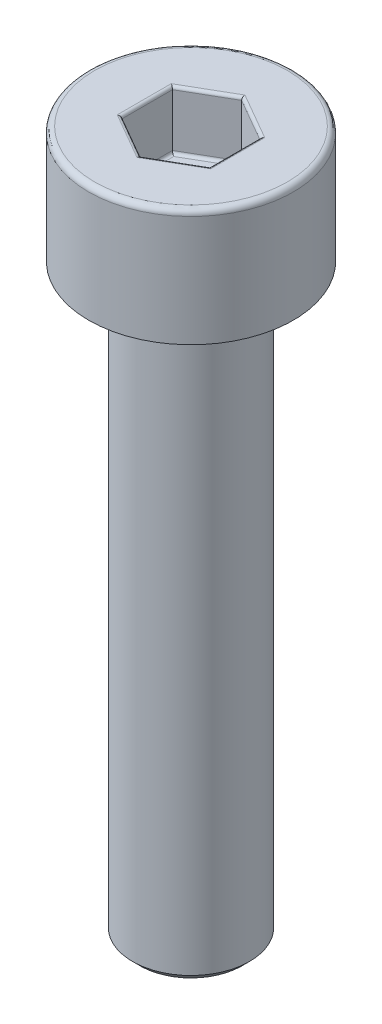
ISO-10303-21;
HEADER;
FILE_DESCRIPTION(('STEP AP214'),'2;1');
FILE_NAME('part.step','',(''),(''),'','','');
FILE_SCHEMA(('AUTOMOTIVE_DESIGN { 1 0 10303 214 1 1 1 1 }'));
ENDSEC;
DATA;
#1=APPLICATION_CONTEXT('core data for automotive mechanical design processes');
#2=APPLICATION_PROTOCOL_DEFINITION('international standard','automotive_design',2000,#1);
#3=PRODUCT_CONTEXT('',#1,'mechanical');
#4=PRODUCT('Part','Part','',(#3));
#5=PRODUCT_RELATED_PRODUCT_CATEGORY('part','',(#4));
#6=PRODUCT_DEFINITION_FORMATION('','',#4);
#7=PRODUCT_DEFINITION_CONTEXT('part definition',#1,'design');
#8=PRODUCT_DEFINITION('design','',#6,#7);
#9=PRODUCT_DEFINITION_SHAPE('','',#8);
#10=(LENGTH_UNIT() NAMED_UNIT(*) SI_UNIT(.MILLI.,.METRE.));
#11=(NAMED_UNIT(*) PLANE_ANGLE_UNIT() SI_UNIT($,.RADIAN.));
#12=(NAMED_UNIT(*) SI_UNIT($,.STERADIAN.) SOLID_ANGLE_UNIT());
#13=UNCERTAINTY_MEASURE_WITH_UNIT(LENGTH_MEASURE(1.E-05),#10,'distance_accuracy_value','');
#14=(GEOMETRIC_REPRESENTATION_CONTEXT(3) GLOBAL_UNCERTAINTY_ASSIGNED_CONTEXT((#13)) GLOBAL_UNIT_ASSIGNED_CONTEXT((#10,
#11,#12)) REPRESENTATION_CONTEXT('',''));
#15=CARTESIAN_POINT('',(0.,0.,0.));
#16=DIRECTION('',(0.,0.,1.));
#17=DIRECTION('',(1.,0.,0.));
#18=AXIS2_PLACEMENT_3D('',#15,#16,#17);
#19=CARTESIAN_POINT('',(0.,-24.,0.));
#20=DIRECTION('',(0.,-1.,0.));
#21=DIRECTION('',(0.,0.,-1.));
#22=AXIS2_PLACEMENT_3D('',#19,#20,#21);
#23=PLANE('',#22);
#24=CARTESIAN_POINT('',(0.,-24.,0.));
#25=DIRECTION('',(0.,-1.,0.));
#26=DIRECTION('',(0.,0.,-1.));
#27=AXIS2_PLACEMENT_3D('',#24,#25,#26);
#28=CIRCLE('',#27,1.74999999999998);
#29=CARTESIAN_POINT('',(0.,-24.,-1.74999999999998));
#30=VERTEX_POINT('',#29);
#31=EDGE_CURVE('E261',#30,#30,#28,.T.);
#32=ORIENTED_EDGE('',*,*,#31,.T.);
#33=EDGE_LOOP('',(#32));
#34=FACE_BOUND('',#33,.T.);
#35=ADVANCED_FACE('F33',(#34),#23,.T.);
#36=CARTESIAN_POINT('',(0.,0.,0.));
#37=DIRECTION('',(0.,1.,0.));
#38=DIRECTION('',(0.,0.,1.));
#39=AXIS2_PLACEMENT_3D('',#36,#37,#38);
#40=CYLINDRICAL_SURFACE('',#39,2.);
#41=CARTESIAN_POINT('',(0.,-4.25,0.));
#42=DIRECTION('',(0.,-1.,0.));
#43=DIRECTION('',(0.,0.,-1.));
#44=AXIS2_PLACEMENT_3D('',#41,#42,#43);
#45=CIRCLE('',#44,2.);
#46=CARTESIAN_POINT('',(0.,-4.25,-2.));
#47=VERTEX_POINT('',#46);
#48=EDGE_CURVE('E258',#47,#47,#45,.T.);
#49=ORIENTED_EDGE('',*,*,#48,.T.);
#50=EDGE_LOOP('',(#49));
#51=FACE_BOUND('',#50,.T.);
#52=CARTESIAN_POINT('',(0.,-23.75,0.));
#53=DIRECTION('',(0.,-1.,0.));
#54=DIRECTION('',(0.,0.,-1.));
#55=AXIS2_PLACEMENT_3D('',#52,#53,#54);
#56=CIRCLE('',#55,2.);
#57=CARTESIAN_POINT('',(0.,-23.75,-2.));
#58=VERTEX_POINT('',#57);
#59=EDGE_CURVE('E255',#58,#58,#56,.F.);
#60=ORIENTED_EDGE('',*,*,#59,.T.);
#61=EDGE_LOOP('',(#60));
#62=FACE_BOUND('',#61,.T.);
#63=ADVANCED_FACE('F287',(#51,#62),#40,.T.);
#64=CARTESIAN_POINT('',(-2.,-4.,0.));
#65=DIRECTION('',(0.,-1.,0.));
#66=DIRECTION('',(0.,0.,-1.));
#67=AXIS2_PLACEMENT_3D('',#64,#65,#66);
#68=PLANE('',#67);
#69=CARTESIAN_POINT('',(0.,-4.,0.));
#70=DIRECTION('',(0.,-1.,0.));
#71=DIRECTION('',(0.,0.,-1.));
#72=AXIS2_PLACEMENT_3D('',#69,#70,#71);
#73=CIRCLE('',#72,2.25);
#74=CARTESIAN_POINT('',(0.,-4.,-2.25));
#75=VERTEX_POINT('',#74);
#76=EDGE_CURVE('E252',#75,#75,#73,.F.);
#77=ORIENTED_EDGE('',*,*,#76,.T.);
#78=EDGE_LOOP('',(#77));
#79=FACE_BOUND('',#78,.T.);
#80=CARTESIAN_POINT('',(0.,-4.,0.));
#81=DIRECTION('',(0.,1.,0.));
#82=DIRECTION('',(0.,0.,1.));
#83=AXIS2_PLACEMENT_3D('',#80,#81,#82);
#84=CIRCLE('',#83,3.5);
#85=CARTESIAN_POINT('',(0.,-4.,3.5));
#86=VERTEX_POINT('',#85);
#87=EDGE_CURVE('E249',#86,#86,#84,.T.);
#88=ORIENTED_EDGE('',*,*,#87,.F.);
#89=EDGE_LOOP('',(#88));
#90=FACE_BOUND('',#89,.T.);
#91=ADVANCED_FACE('F293',(#79,#90),#68,.T.);
#92=CARTESIAN_POINT('',(0.,0.,0.));
#93=DIRECTION('',(0.,1.,0.));
#94=DIRECTION('',(0.,0.,1.));
#95=AXIS2_PLACEMENT_3D('',#92,#93,#94);
#96=CYLINDRICAL_SURFACE('',#95,3.5);
#97=CARTESIAN_POINT('',(0.,-0.2,0.));
#98=DIRECTION('',(0.,1.,0.));
#99=DIRECTION('',(0.,0.,1.));
#100=AXIS2_PLACEMENT_3D('',#97,#98,#99);
#101=CIRCLE('',#100,3.5);
#102=CARTESIAN_POINT('',(0.,-0.2,3.5));
#103=VERTEX_POINT('',#102);
#104=EDGE_CURVE('E159',#103,#103,#101,.F.);
#105=ORIENTED_EDGE('',*,*,#104,.T.);
#106=EDGE_LOOP('',(#105));
#107=FACE_BOUND('',#106,.T.);
#108=ORIENTED_EDGE('',*,*,#87,.T.);
#109=EDGE_LOOP('',(#108));
#110=FACE_BOUND('',#109,.T.);
#111=ADVANCED_FACE('F303',(#107,#110),#96,.T.);
#112=CARTESIAN_POINT('',(-3.5,0.,0.));
#113=DIRECTION('',(0.,1.,0.));
#114=DIRECTION('',(0.,0.,1.));
#115=AXIS2_PLACEMENT_3D('',#112,#113,#114);
#116=PLANE('',#115);
#117=DIRECTION('',(0.,0.,1.));
#118=VECTOR('',#117,1.);
#119=CARTESIAN_POINT('',(-1.6,0.,-0.86602540378444));
#120=LINE('',#119,#118);
#121=CARTESIAN_POINT('',(-1.6,0.,0.923760430703401));
#122=VERTEX_POINT('',#121);
#123=CARTESIAN_POINT('',(-1.6,0.,-0.923760430703403));
#124=VERTEX_POINT('',#123);
#125=EDGE_CURVE('E175',#122,#124,#120,.F.);
#126=ORIENTED_EDGE('',*,*,#125,.T.);
#127=DIRECTION('',(-0.866025403784439,0.,0.5));
#128=VECTOR('',#127,1.);
#129=CARTESIAN_POINT('',(-0.0499999999999999,0.,-1.81865334794732));
#130=LINE('',#129,#128);
#131=CARTESIAN_POINT('',(0.,0.,-1.8475208614068));
#132=VERTEX_POINT('',#131);
#133=EDGE_CURVE('E134',#124,#132,#130,.F.);
#134=ORIENTED_EDGE('',*,*,#133,.T.);
#135=DIRECTION('',(-0.866025403784439,0.,-0.5));
#136=VECTOR('',#135,1.);
#137=CARTESIAN_POINT('',(1.55,0.,-0.952627944162884));
#138=LINE('',#137,#136);
#139=CARTESIAN_POINT('',(1.6,0.,-0.923760430703403));
#140=VERTEX_POINT('',#139);
#141=EDGE_CURVE('E161',#132,#140,#138,.F.);
#142=ORIENTED_EDGE('',*,*,#141,.T.);
#143=DIRECTION('',(0.,0.,-1.));
#144=VECTOR('',#143,1.);
#145=CARTESIAN_POINT('',(1.6,0.,0.866025403784439));
#146=LINE('',#145,#144);
#147=CARTESIAN_POINT('',(1.6,0.,0.923760430703402));
#148=VERTEX_POINT('',#147);
#149=EDGE_CURVE('E169',#140,#148,#146,.F.);
#150=ORIENTED_EDGE('',*,*,#149,.T.);
#151=DIRECTION('',(0.866025403784439,0.,-0.5));
#152=VECTOR('',#151,1.);
#153=CARTESIAN_POINT('',(0.0499999999999988,0.,1.81865334794732));
#154=LINE('',#153,#152);
#155=CARTESIAN_POINT('',(0.,0.,1.8475208614068));
#156=VERTEX_POINT('',#155);
#157=EDGE_CURVE('E171',#148,#156,#154,.F.);
#158=ORIENTED_EDGE('',*,*,#157,.T.);
#159=DIRECTION('',(0.866025403784439,0.,0.5));
#160=VECTOR('',#159,1.);
#161=CARTESIAN_POINT('',(-1.55,0.,0.952627944162882));
#162=LINE('',#161,#160);
#163=EDGE_CURVE('E173',#156,#122,#162,.F.);
#164=ORIENTED_EDGE('',*,*,#163,.T.);
#165=EDGE_LOOP('',(#126,#134,#142,#150,#158,#164));
#166=FACE_BOUND('',#165,.T.);
#167=CARTESIAN_POINT('',(0.,0.,0.));
#168=DIRECTION('',(0.,1.,0.));
#169=DIRECTION('',(0.,0.,1.));
#170=AXIS2_PLACEMENT_3D('',#167,#168,#169);
#171=CIRCLE('',#170,3.3);
#172=CARTESIAN_POINT('',(0.,0.,3.3));
#173=VERTEX_POINT('',#172);
#174=EDGE_CURVE('E164',#173,#173,#171,.T.);
#175=ORIENTED_EDGE('',*,*,#174,.T.);
#176=EDGE_LOOP('',(#175));
#177=FACE_BOUND('',#176,.T.);
#178=ADVANCED_FACE('F266',(#166,#177),#116,.T.);
#179=CARTESIAN_POINT('',(0.,-4.,0.));
#180=DIRECTION('',(0.,1.,0.));
#181=DIRECTION('',(0.,0.,1.));
#182=AXIS2_PLACEMENT_3D('',#179,#180,#181);
#183=CONICAL_SURFACE('',#182,2.25,0.785398163397454);
#184=ORIENTED_EDGE('',*,*,#48,.F.);
#185=EDGE_LOOP('',(#184));
#186=FACE_BOUND('',#185,.T.);
#187=ORIENTED_EDGE('',*,*,#76,.F.);
#188=EDGE_LOOP('',(#187));
#189=FACE_BOUND('',#188,.T.);
#190=ADVANCED_FACE('F281',(#186,#189),#183,.T.);
#191=CARTESIAN_POINT('',(0.,-23.75,0.));
#192=DIRECTION('',(0.,1.,0.));
#193=DIRECTION('',(0.,0.,1.));
#194=AXIS2_PLACEMENT_3D('',#191,#192,#193);
#195=CONICAL_SURFACE('',#194,2.,0.785398163397456);
#196=ORIENTED_EDGE('',*,*,#31,.F.);
#197=EDGE_LOOP('',(#196));
#198=FACE_BOUND('',#197,.T.);
#199=ORIENTED_EDGE('',*,*,#59,.F.);
#200=EDGE_LOOP('',(#199));
#201=FACE_BOUND('',#200,.T.);
#202=ADVANCED_FACE('F271',(#198,#201),#195,.T.);
#203=CARTESIAN_POINT('',(0.,-0.2,0.));
#204=DIRECTION('',(0.,1.,0.));
#205=DIRECTION('',(0.,0.,1.));
#206=AXIS2_PLACEMENT_3D('',#203,#204,#205);
#207=TOROIDAL_SURFACE('',#206,3.3,0.2);
#208=ORIENTED_EDGE('',*,*,#104,.F.);
#209=EDGE_LOOP('',(#208));
#210=FACE_BOUND('',#209,.T.);
#211=ORIENTED_EDGE('',*,*,#174,.F.);
#212=EDGE_LOOP('',(#211));
#213=FACE_BOUND('',#212,.T.);
#214=ADVANCED_FACE('F268',(#210,#213),#207,.T.);
#215=CARTESIAN_POINT('',(1.5,-2.,-0.86602540378444));
#216=DIRECTION('',(0.5,0.,-0.866025403784439));
#217=DIRECTION('',(-0.866025403784439,0.,-0.5));
#218=AXIS2_PLACEMENT_3D('',#215,#216,#217);
#219=PLANE('',#218);
#220=DIRECTION('',(0.,1.,0.));
#221=VECTOR('',#220,1.);
#222=CARTESIAN_POINT('',(1.5,-2.,-0.86602540378444));
#223=LINE('',#222,#221);
#224=CARTESIAN_POINT('',(1.5,-1.9,-0.86602540378444));
#225=VERTEX_POINT('',#224);
#226=CARTESIAN_POINT('',(1.5,-0.1,-0.86602540378444));
#227=VERTEX_POINT('',#226);
#228=EDGE_CURVE('E243',#225,#227,#223,.T.);
#229=ORIENTED_EDGE('',*,*,#228,.T.);
#230=DIRECTION('',(-0.866025403784439,0.,-0.5));
#231=VECTOR('',#230,1.);
#232=CARTESIAN_POINT('',(0.,-0.1,-1.73205080756888));
#233=LINE('',#232,#231);
#234=CARTESIAN_POINT('',(0.,-0.1,-1.73205080756888));
#235=VERTEX_POINT('',#234);
#236=EDGE_CURVE('E195',#227,#235,#233,.T.);
#237=ORIENTED_EDGE('',*,*,#236,.T.);
#238=DIRECTION('',(0.,1.,0.));
#239=VECTOR('',#238,1.);
#240=CARTESIAN_POINT('',(0.,-2.,-1.73205080756888));
#241=LINE('',#240,#239);
#242=CARTESIAN_POINT('',(0.,-1.9,-1.73205080756888));
#243=VERTEX_POINT('',#242);
#244=EDGE_CURVE('E145',#243,#235,#241,.T.);
#245=ORIENTED_EDGE('',*,*,#244,.F.);
#246=DIRECTION('',(-0.866025403784439,0.,-0.5));
#247=VECTOR('',#246,1.);
#248=CARTESIAN_POINT('',(1.5,-1.9,-0.86602540378444));
#249=LINE('',#248,#247);
#250=EDGE_CURVE('E193',#243,#225,#249,.F.);
#251=ORIENTED_EDGE('',*,*,#250,.T.);
#252=EDGE_LOOP('',(#229,#237,#245,#251));
#253=FACE_BOUND('',#252,.T.);
#254=ADVANCED_FACE('F270',(#253),#219,.F.);
#255=CARTESIAN_POINT('',(1.5,-2.,0.866025403784439));
#256=DIRECTION('',(1.,0.,0.));
#257=DIRECTION('',(0.,0.,-1.));
#258=AXIS2_PLACEMENT_3D('',#255,#256,#257);
#259=PLANE('',#258);
#260=DIRECTION('',(0.,1.,0.));
#261=VECTOR('',#260,1.);
#262=CARTESIAN_POINT('',(1.5,-2.,0.866025403784439));
#263=LINE('',#262,#261);
#264=CARTESIAN_POINT('',(1.5,-1.9,0.866025403784439));
#265=VERTEX_POINT('',#264);
#266=CARTESIAN_POINT('',(1.5,-0.1,0.866025403784439));
#267=VERTEX_POINT('',#266);
#268=EDGE_CURVE('E240',#265,#267,#263,.T.);
#269=ORIENTED_EDGE('',*,*,#268,.T.);
#270=DIRECTION('',(0.,0.,-1.));
#271=VECTOR('',#270,1.);
#272=CARTESIAN_POINT('',(1.5,-0.1,-0.86602540378444));
#273=LINE('',#272,#271);
#274=EDGE_CURVE('E191',#267,#227,#273,.T.);
#275=ORIENTED_EDGE('',*,*,#274,.T.);
#276=ORIENTED_EDGE('',*,*,#228,.F.);
#277=DIRECTION('',(0.,0.,-1.));
#278=VECTOR('',#277,1.);
#279=CARTESIAN_POINT('',(1.5,-1.9,0.866025403784439));
#280=LINE('',#279,#278);
#281=EDGE_CURVE('E188',#225,#265,#280,.F.);
#282=ORIENTED_EDGE('',*,*,#281,.T.);
#283=EDGE_LOOP('',(#269,#275,#276,#282));
#284=FACE_BOUND('',#283,.T.);
#285=ADVANCED_FACE('F278',(#284),#259,.F.);
#286=CARTESIAN_POINT('',(0.,-2.,1.73205080756888));
#287=DIRECTION('',(0.5,0.,0.866025403784439));
#288=DIRECTION('',(0.866025403784439,0.,-0.5));
#289=AXIS2_PLACEMENT_3D('',#286,#287,#288);
#290=PLANE('',#289);
#291=DIRECTION('',(0.,1.,0.));
#292=VECTOR('',#291,1.);
#293=CARTESIAN_POINT('',(0.,-2.,1.73205080756888));
#294=LINE('',#293,#292);
#295=CARTESIAN_POINT('',(0.,-1.9,1.73205080756888));
#296=VERTEX_POINT('',#295);
#297=CARTESIAN_POINT('',(0.,-0.1,1.73205080756888));
#298=VERTEX_POINT('',#297);
#299=EDGE_CURVE('E237',#296,#298,#294,.T.);
#300=ORIENTED_EDGE('',*,*,#299,.T.);
#301=DIRECTION('',(0.866025403784439,0.,-0.5));
#302=VECTOR('',#301,1.);
#303=CARTESIAN_POINT('',(1.5,-0.1,0.866025403784439));
#304=LINE('',#303,#302);
#305=EDGE_CURVE('E186',#298,#267,#304,.T.);
#306=ORIENTED_EDGE('',*,*,#305,.T.);
#307=ORIENTED_EDGE('',*,*,#268,.F.);
#308=DIRECTION('',(0.866025403784439,0.,-0.5));
#309=VECTOR('',#308,1.);
#310=CARTESIAN_POINT('',(0.,-1.9,1.73205080756888));
#311=LINE('',#310,#309);
#312=EDGE_CURVE('E184',#265,#296,#311,.F.);
#313=ORIENTED_EDGE('',*,*,#312,.T.);
#314=EDGE_LOOP('',(#300,#306,#307,#313));
#315=FACE_BOUND('',#314,.T.);
#316=ADVANCED_FACE('F327',(#315),#290,.F.);
#317=CARTESIAN_POINT('',(-1.5,-2.,0.866025403784438));
#318=DIRECTION('',(-0.5,0.,0.866025403784439));
#319=DIRECTION('',(0.866025403784439,0.,0.5));
#320=AXIS2_PLACEMENT_3D('',#317,#318,#319);
#321=PLANE('',#320);
#322=DIRECTION('',(0.,1.,0.));
#323=VECTOR('',#322,1.);
#324=CARTESIAN_POINT('',(-1.5,-2.,0.866025403784438));
#325=LINE('',#324,#323);
#326=CARTESIAN_POINT('',(-1.5,-1.9,0.866025403784438));
#327=VERTEX_POINT('',#326);
#328=CARTESIAN_POINT('',(-1.5,-0.1,0.866025403784438));
#329=VERTEX_POINT('',#328);
#330=EDGE_CURVE('E128',#327,#329,#325,.T.);
#331=ORIENTED_EDGE('',*,*,#330,.T.);
#332=DIRECTION('',(0.866025403784439,0.,0.5));
#333=VECTOR('',#332,1.);
#334=CARTESIAN_POINT('',(0.,-0.1,1.73205080756888));
#335=LINE('',#334,#333);
#336=EDGE_CURVE('E182',#329,#298,#335,.T.);
#337=ORIENTED_EDGE('',*,*,#336,.T.);
#338=ORIENTED_EDGE('',*,*,#299,.F.);
#339=DIRECTION('',(0.866025403784439,0.,0.5));
#340=VECTOR('',#339,1.);
#341=CARTESIAN_POINT('',(-1.5,-1.9,0.866025403784438));
#342=LINE('',#341,#340);
#343=EDGE_CURVE('E180',#296,#327,#342,.F.);
#344=ORIENTED_EDGE('',*,*,#343,.T.);
#345=EDGE_LOOP('',(#331,#337,#338,#344));
#346=FACE_BOUND('',#345,.T.);
#347=ADVANCED_FACE('F234',(#346),#321,.F.);
#348=CARTESIAN_POINT('',(-1.5,-2.,-0.86602540378444));
#349=DIRECTION('',(-1.,0.,0.));
#350=DIRECTION('',(0.,0.,1.));
#351=AXIS2_PLACEMENT_3D('',#348,#349,#350);
#352=PLANE('',#351);
#353=DIRECTION('',(0.,1.,0.));
#354=VECTOR('',#353,1.);
#355=CARTESIAN_POINT('',(-1.5,-2.,-0.86602540378444));
#356=LINE('',#355,#354);
#357=CARTESIAN_POINT('',(-1.5,-1.9,-0.86602540378444));
#358=VERTEX_POINT('',#357);
#359=CARTESIAN_POINT('',(-1.5,-0.1,-0.86602540378444));
#360=VERTEX_POINT('',#359);
#361=EDGE_CURVE('E126',#358,#360,#356,.T.);
#362=ORIENTED_EDGE('',*,*,#361,.T.);
#363=DIRECTION('',(0.,0.,1.));
#364=VECTOR('',#363,1.);
#365=CARTESIAN_POINT('',(-1.5,-0.1,0.866025403784438));
#366=LINE('',#365,#364);
#367=EDGE_CURVE('E133',#360,#329,#366,.T.);
#368=ORIENTED_EDGE('',*,*,#367,.T.);
#369=ORIENTED_EDGE('',*,*,#330,.F.);
#370=DIRECTION('',(0.,0.,1.));
#371=VECTOR('',#370,1.);
#372=CARTESIAN_POINT('',(-1.5,-1.9,-0.86602540378444));
#373=LINE('',#372,#371);
#374=EDGE_CURVE('E123',#327,#358,#373,.F.);
#375=ORIENTED_EDGE('',*,*,#374,.T.);
#376=EDGE_LOOP('',(#362,#368,#369,#375));
#377=FACE_BOUND('',#376,.T.);
#378=ADVANCED_FACE('F125',(#377),#352,.F.);
#379=CARTESIAN_POINT('',(0.,-2.,-1.73205080756888));
#380=DIRECTION('',(-0.5,0.,-0.866025403784439));
#381=DIRECTION('',(-0.866025403784439,0.,0.5));
#382=AXIS2_PLACEMENT_3D('',#379,#380,#381);
#383=PLANE('',#382);
#384=ORIENTED_EDGE('',*,*,#244,.T.);
#385=DIRECTION('',(-0.866025403784439,0.,0.5));
#386=VECTOR('',#385,1.);
#387=CARTESIAN_POINT('',(-1.5,-0.1,-0.86602540378444));
#388=LINE('',#387,#386);
#389=EDGE_CURVE('E144',#235,#360,#388,.T.);
#390=ORIENTED_EDGE('',*,*,#389,.T.);
#391=ORIENTED_EDGE('',*,*,#361,.F.);
#392=DIRECTION('',(-0.866025403784439,0.,0.5));
#393=VECTOR('',#392,1.);
#394=CARTESIAN_POINT('',(0.,-1.9,-1.73205080756888));
#395=LINE('',#394,#393);
#396=EDGE_CURVE('E141',#358,#243,#395,.F.);
#397=ORIENTED_EDGE('',*,*,#396,.T.);
#398=EDGE_LOOP('',(#384,#390,#391,#397));
#399=FACE_BOUND('',#398,.T.);
#400=ADVANCED_FACE('F139',(#399),#383,.F.);
#401=CARTESIAN_POINT('',(1.5,-2.,-0.86602540378444));
#402=DIRECTION('',(0.,-1.,0.));
#403=DIRECTION('',(0.,0.,-1.));
#404=AXIS2_PLACEMENT_3D('',#401,#402,#403);
#405=PLANE('',#404);
#406=DIRECTION('',(0.866025403784439,0.,-0.5));
#407=VECTOR('',#406,1.);
#408=CARTESIAN_POINT('',(1.45,-2.,0.779422863405995));
#409=LINE('',#408,#407);
#410=CARTESIAN_POINT('',(0.,-2.,1.61658075373095));
#411=VERTEX_POINT('',#410);
#412=CARTESIAN_POINT('',(1.4,-2.,0.808290376865476));
#413=VERTEX_POINT('',#412);
#414=EDGE_CURVE('E42',#411,#413,#409,.T.);
#415=ORIENTED_EDGE('',*,*,#414,.T.);
#416=DIRECTION('',(0.,0.,-1.));
#417=VECTOR('',#416,1.);
#418=CARTESIAN_POINT('',(1.4,-2.,-0.86602540378444));
#419=LINE('',#418,#417);
#420=CARTESIAN_POINT('',(1.4,-2.,-0.808290376865478));
#421=VERTEX_POINT('',#420);
#422=EDGE_CURVE('E11',#413,#421,#419,.T.);
#423=ORIENTED_EDGE('',*,*,#422,.T.);
#424=DIRECTION('',(-0.866025403784439,0.,-0.5));
#425=VECTOR('',#424,1.);
#426=CARTESIAN_POINT('',(-0.0500000000000001,-2.,-1.64544826719043));
#427=LINE('',#426,#425);
#428=CARTESIAN_POINT('',(0.,-2.,-1.61658075373095));
#429=VERTEX_POINT('',#428);
#430=EDGE_CURVE('E197',#421,#429,#427,.T.);
#431=ORIENTED_EDGE('',*,*,#430,.T.);
#432=DIRECTION('',(-0.866025403784439,0.,0.5));
#433=VECTOR('',#432,1.);
#434=CARTESIAN_POINT('',(-1.45,-2.,-0.779422863405997));
#435=LINE('',#434,#433);
#436=CARTESIAN_POINT('',(-1.4,-2.,-0.808290376865478));
#437=VERTEX_POINT('',#436);
#438=EDGE_CURVE('E199',#429,#437,#435,.T.);
#439=ORIENTED_EDGE('',*,*,#438,.T.);
#440=DIRECTION('',(0.,0.,1.));
#441=VECTOR('',#440,1.);
#442=CARTESIAN_POINT('',(-1.4,-2.,0.866025403784438));
#443=LINE('',#442,#441);
#444=CARTESIAN_POINT('',(-1.4,-2.,0.808290376865476));
#445=VERTEX_POINT('',#444);
#446=EDGE_CURVE('E150',#437,#445,#443,.T.);
#447=ORIENTED_EDGE('',*,*,#446,.T.);
#448=DIRECTION('',(0.866025403784439,0.,0.5));
#449=VECTOR('',#448,1.);
#450=CARTESIAN_POINT('',(0.0499999999999989,-2.,1.64544826719043));
#451=LINE('',#450,#449);
#452=EDGE_CURVE('E53',#445,#411,#451,.T.);
#453=ORIENTED_EDGE('',*,*,#452,.T.);
#454=EDGE_LOOP('',(#415,#423,#431,#439,#447,#453));
#455=FACE_BOUND('',#454,.T.);
#456=ADVANCED_FACE('F322',(#455),#405,.F.);
#457=CARTESIAN_POINT('',(0.0499999999999988,-0.1,1.81865334794732));
#458=DIRECTION('',(-0.866025403784439,0.,0.5));
#459=DIRECTION('',(0.5,0.,0.866025403784439));
#460=AXIS2_PLACEMENT_3D('',#457,#458,#459);
#461=CYLINDRICAL_SURFACE('',#460,0.1);
#462=CARTESIAN_POINT('',(0.,-0.1,1.8475208614068));
#463=DIRECTION('',(-1.,0.,0.));
#464=DIRECTION('',(0.,0.,-1.));
#465=AXIS2_PLACEMENT_3D('',#462,#463,#464);
#466=ELLIPSE('',#465,0.115470053837925,0.1);
#467=EDGE_CURVE('E214',#156,#298,#466,.T.);
#468=ORIENTED_EDGE('',*,*,#467,.F.);
#469=ORIENTED_EDGE('',*,*,#157,.F.);
#470=CARTESIAN_POINT('',(1.6,-0.1,0.923760430703402));
#471=DIRECTION('',(-0.5,0.,0.866025403784439));
#472=DIRECTION('',(-0.866025403784439,0.,-0.5));
#473=AXIS2_PLACEMENT_3D('',#470,#471,#472);
#474=ELLIPSE('',#473,0.115470053837925,0.1);
#475=EDGE_CURVE('E217',#267,#148,#474,.F.);
#476=ORIENTED_EDGE('',*,*,#475,.F.);
#477=ORIENTED_EDGE('',*,*,#305,.F.);
#478=EDGE_LOOP('',(#468,#469,#476,#477));
#479=FACE_BOUND('',#478,.T.);
#480=ADVANCED_FACE('F334',(#479),#461,.T.);
#481=CARTESIAN_POINT('',(1.6,-0.1,0.866025403784439));
#482=DIRECTION('',(0.,0.,1.));
#483=DIRECTION('',(1.,0.,0.));
#484=AXIS2_PLACEMENT_3D('',#481,#482,#483);
#485=CYLINDRICAL_SURFACE('',#484,0.1);
#486=ORIENTED_EDGE('',*,*,#475,.T.);
#487=ORIENTED_EDGE('',*,*,#149,.F.);
#488=CARTESIAN_POINT('',(1.6,-0.1,-0.923760430703402));
#489=DIRECTION('',(0.5,0.,0.866025403784439));
#490=DIRECTION('',(-0.866025403784439,0.,0.5));
#491=AXIS2_PLACEMENT_3D('',#488,#489,#490);
#492=ELLIPSE('',#491,0.115470053837925,0.1);
#493=EDGE_CURVE('E211',#227,#140,#492,.F.);
#494=ORIENTED_EDGE('',*,*,#493,.F.);
#495=ORIENTED_EDGE('',*,*,#274,.F.);
#496=EDGE_LOOP('',(#486,#487,#494,#495));
#497=FACE_BOUND('',#496,.T.);
#498=ADVANCED_FACE('F338',(#497),#485,.T.);
#499=CARTESIAN_POINT('',(-1.55,-0.1,0.952627944162882));
#500=DIRECTION('',(-0.866025403784439,0.,-0.5));
#501=DIRECTION('',(-0.5,0.,0.866025403784439));
#502=AXIS2_PLACEMENT_3D('',#499,#500,#501);
#503=CYLINDRICAL_SURFACE('',#502,0.1);
#504=ORIENTED_EDGE('',*,*,#467,.T.);
#505=ORIENTED_EDGE('',*,*,#336,.F.);
#506=CARTESIAN_POINT('',(-1.6,-0.1,0.923760430703401));
#507=DIRECTION('',(-0.5,0.,-0.866025403784439));
#508=DIRECTION('',(0.866025403784439,0.,-0.5));
#509=AXIS2_PLACEMENT_3D('',#506,#507,#508);
#510=ELLIPSE('',#509,0.115470053837925,0.1);
#511=EDGE_CURVE('E208',#122,#329,#510,.T.);
#512=ORIENTED_EDGE('',*,*,#511,.F.);
#513=ORIENTED_EDGE('',*,*,#163,.F.);
#514=EDGE_LOOP('',(#504,#505,#512,#513));
#515=FACE_BOUND('',#514,.T.);
#516=ADVANCED_FACE('F344',(#515),#503,.T.);
#517=CARTESIAN_POINT('',(1.55,-0.1,-0.952627944162884));
#518=DIRECTION('',(0.866025403784439,0.,0.5));
#519=DIRECTION('',(0.5,0.,-0.866025403784439));
#520=AXIS2_PLACEMENT_3D('',#517,#518,#519);
#521=CYLINDRICAL_SURFACE('',#520,0.1);
#522=ORIENTED_EDGE('',*,*,#493,.T.);
#523=ORIENTED_EDGE('',*,*,#141,.F.);
#524=CARTESIAN_POINT('',(0.,-0.1,-1.8475208614068));
#525=DIRECTION('',(1.,0.,0.));
#526=DIRECTION('',(0.,0.,-1.));
#527=AXIS2_PLACEMENT_3D('',#524,#525,#526);
#528=ELLIPSE('',#527,0.115470053837925,0.1);
#529=EDGE_CURVE('E206',#235,#132,#528,.F.);
#530=ORIENTED_EDGE('',*,*,#529,.F.);
#531=ORIENTED_EDGE('',*,*,#236,.F.);
#532=EDGE_LOOP('',(#522,#523,#530,#531));
#533=FACE_BOUND('',#532,.T.);
#534=ADVANCED_FACE('F374',(#533),#521,.T.);
#535=CARTESIAN_POINT('',(-1.6,-0.1,-0.86602540378444));
#536=DIRECTION('',(0.,0.,-1.));
#537=DIRECTION('',(-1.,0.,0.));
#538=AXIS2_PLACEMENT_3D('',#535,#536,#537);
#539=CYLINDRICAL_SURFACE('',#538,0.1);
#540=ORIENTED_EDGE('',*,*,#511,.T.);
#541=ORIENTED_EDGE('',*,*,#367,.F.);
#542=CARTESIAN_POINT('',(-1.6,-0.1,-0.923760430703403));
#543=DIRECTION('',(0.5,0.,-0.866025403784439));
#544=DIRECTION('',(0.866025403784439,0.,0.5));
#545=AXIS2_PLACEMENT_3D('',#542,#543,#544);
#546=ELLIPSE('',#545,0.115470053837925,0.1);
#547=EDGE_CURVE('E204',#124,#360,#546,.T.);
#548=ORIENTED_EDGE('',*,*,#547,.F.);
#549=ORIENTED_EDGE('',*,*,#125,.F.);
#550=EDGE_LOOP('',(#540,#541,#548,#549));
#551=FACE_BOUND('',#550,.T.);
#552=ADVANCED_FACE('F369',(#551),#539,.T.);
#553=CARTESIAN_POINT('',(-0.05,-0.1,-1.81865334794732));
#554=DIRECTION('',(0.866025403784439,0.,-0.5));
#555=DIRECTION('',(-0.5,0.,-0.866025403784439));
#556=AXIS2_PLACEMENT_3D('',#553,#554,#555);
#557=CYLINDRICAL_SURFACE('',#556,0.1);
#558=ORIENTED_EDGE('',*,*,#529,.T.);
#559=ORIENTED_EDGE('',*,*,#133,.F.);
#560=ORIENTED_EDGE('',*,*,#547,.T.);
#561=ORIENTED_EDGE('',*,*,#389,.F.);
#562=EDGE_LOOP('',(#558,#559,#560,#561));
#563=FACE_BOUND('',#562,.T.);
#564=ADVANCED_FACE('F365',(#563),#557,.T.);
#565=CARTESIAN_POINT('',(-1.4,-1.9,-0.86602540378444));
#566=DIRECTION('',(0.,0.,-1.));
#567=DIRECTION('',(-1.,0.,0.));
#568=AXIS2_PLACEMENT_3D('',#565,#566,#567);
#569=CYLINDRICAL_SURFACE('',#568,0.1);
#570=CARTESIAN_POINT('',(-1.4,-1.9,-0.808290376865478));
#571=DIRECTION('',(0.5,0.,-0.866025403784439));
#572=DIRECTION('',(-0.866025403784439,0.,-0.5));
#573=AXIS2_PLACEMENT_3D('',#570,#571,#572);
#574=ELLIPSE('',#573,0.115470053837925,0.1);
#575=EDGE_CURVE('E149',#358,#437,#574,.F.);
#576=ORIENTED_EDGE('',*,*,#575,.F.);
#577=ORIENTED_EDGE('',*,*,#374,.F.);
#578=CARTESIAN_POINT('',(-1.4,-1.9,0.808290376865476));
#579=DIRECTION('',(-0.5,0.,-0.866025403784439));
#580=DIRECTION('',(-0.866025403784439,0.,0.5));
#581=AXIS2_PLACEMENT_3D('',#578,#579,#580);
#582=ELLIPSE('',#581,0.115470053837925,0.1);
#583=EDGE_CURVE('E37',#445,#327,#582,.T.);
#584=ORIENTED_EDGE('',*,*,#583,.F.);
#585=ORIENTED_EDGE('',*,*,#446,.F.);
#586=EDGE_LOOP('',(#576,#577,#584,#585));
#587=FACE_BOUND('',#586,.T.);
#588=ADVANCED_FACE('F35',(#587),#569,.F.);
#589=CARTESIAN_POINT('',(0.0499999999999984,-1.9,1.64544826719043));
#590=DIRECTION('',(-0.866025403784439,0.,-0.5));
#591=DIRECTION('',(-0.5,0.,0.866025403784439));
#592=AXIS2_PLACEMENT_3D('',#589,#590,#591);
#593=CYLINDRICAL_SURFACE('',#592,0.1);
#594=ORIENTED_EDGE('',*,*,#583,.T.);
#595=ORIENTED_EDGE('',*,*,#343,.F.);
#596=CARTESIAN_POINT('',(0.,-1.9,1.61658075373095));
#597=DIRECTION('',(-1.,0.,0.));
#598=DIRECTION('',(0.,0.,1.));
#599=AXIS2_PLACEMENT_3D('',#596,#597,#598);
#600=ELLIPSE('',#599,0.115470053837925,0.1);
#601=EDGE_CURVE('E153',#411,#296,#600,.T.);
#602=ORIENTED_EDGE('',*,*,#601,.F.);
#603=ORIENTED_EDGE('',*,*,#452,.F.);
#604=EDGE_LOOP('',(#594,#595,#602,#603));
#605=FACE_BOUND('',#604,.T.);
#606=ADVANCED_FACE('F231',(#605),#593,.F.);
#607=CARTESIAN_POINT('',(0.8,-1.9,-2.07846096908265));
#608=DIRECTION('',(0.866025403784439,0.,-0.5));
#609=DIRECTION('',(-0.5,0.,-0.866025403784439));
#610=AXIS2_PLACEMENT_3D('',#607,#608,#609);
#611=CYLINDRICAL_SURFACE('',#610,0.1);
#612=ORIENTED_EDGE('',*,*,#575,.T.);
#613=ORIENTED_EDGE('',*,*,#438,.F.);
#614=CARTESIAN_POINT('',(0.,-1.9,-1.61658075373095));
#615=DIRECTION('',(1.,0.,0.));
#616=DIRECTION('',(0.,0.,-1.));
#617=AXIS2_PLACEMENT_3D('',#614,#615,#616);
#618=ELLIPSE('',#617,0.115470053837925,0.1);
#619=EDGE_CURVE('E157',#243,#429,#618,.F.);
#620=ORIENTED_EDGE('',*,*,#619,.F.);
#621=ORIENTED_EDGE('',*,*,#396,.F.);
#622=EDGE_LOOP('',(#612,#613,#620,#621));
#623=FACE_BOUND('',#622,.T.);
#624=ADVANCED_FACE('F155',(#623),#611,.F.);
#625=CARTESIAN_POINT('',(2.2,-1.9,0.346410161513775));
#626=DIRECTION('',(-0.866025403784439,0.,0.5));
#627=DIRECTION('',(0.5,0.,0.866025403784439));
#628=AXIS2_PLACEMENT_3D('',#625,#626,#627);
#629=CYLINDRICAL_SURFACE('',#628,0.1);
#630=ORIENTED_EDGE('',*,*,#601,.T.);
#631=ORIENTED_EDGE('',*,*,#312,.F.);
#632=CARTESIAN_POINT('',(1.4,-1.9,0.808290376865476));
#633=DIRECTION('',(-0.5,0.,0.866025403784439));
#634=DIRECTION('',(0.866025403784439,0.,0.5));
#635=AXIS2_PLACEMENT_3D('',#632,#633,#634);
#636=ELLIPSE('',#635,0.115470053837925,0.1);
#637=EDGE_CURVE('E222',#413,#265,#636,.T.);
#638=ORIENTED_EDGE('',*,*,#637,.F.);
#639=ORIENTED_EDGE('',*,*,#414,.F.);
#640=EDGE_LOOP('',(#630,#631,#638,#639));
#641=FACE_BOUND('',#640,.T.);
#642=ADVANCED_FACE('F228',(#641),#629,.F.);
#643=CARTESIAN_POINT('',(1.45,-1.9,-0.779422863405997));
#644=DIRECTION('',(0.866025403784439,0.,0.5));
#645=DIRECTION('',(0.5,0.,-0.866025403784439));
#646=AXIS2_PLACEMENT_3D('',#643,#644,#645);
#647=CYLINDRICAL_SURFACE('',#646,0.1);
#648=ORIENTED_EDGE('',*,*,#619,.T.);
#649=ORIENTED_EDGE('',*,*,#430,.F.);
#650=CARTESIAN_POINT('',(1.4,-1.9,-0.808290376865478));
#651=DIRECTION('',(0.5,0.,0.866025403784439));
#652=DIRECTION('',(-0.866025403784439,0.,0.5));
#653=AXIS2_PLACEMENT_3D('',#650,#651,#652);
#654=ELLIPSE('',#653,0.115470053837925,0.1);
#655=EDGE_CURVE('E220',#225,#421,#654,.F.);
#656=ORIENTED_EDGE('',*,*,#655,.F.);
#657=ORIENTED_EDGE('',*,*,#250,.F.);
#658=EDGE_LOOP('',(#648,#649,#656,#657));
#659=FACE_BOUND('',#658,.T.);
#660=ADVANCED_FACE('F353',(#659),#647,.F.);
#661=CARTESIAN_POINT('',(1.4,-1.9,-0.86602540378444));
#662=DIRECTION('',(0.,0.,1.));
#663=DIRECTION('',(1.,0.,0.));
#664=AXIS2_PLACEMENT_3D('',#661,#662,#663);
#665=CYLINDRICAL_SURFACE('',#664,0.1);
#666=ORIENTED_EDGE('',*,*,#637,.T.);
#667=ORIENTED_EDGE('',*,*,#281,.F.);
#668=ORIENTED_EDGE('',*,*,#655,.T.);
#669=ORIENTED_EDGE('',*,*,#422,.F.);
#670=EDGE_LOOP('',(#666,#667,#668,#669));
#671=FACE_BOUND('',#670,.T.);
#672=ADVANCED_FACE('F350',(#671),#665,.F.);
#673=CLOSED_SHELL('',(#35,#63,#91,#111,#178,#190,#202,#214,#254,#285,#316,#347,#378,#400,#456,
#480,#498,#516,#534,#552,#564,#588,#606,#624,#642,#660,#672));
#674=MANIFOLD_SOLID_BREP('B2',#673);
#675=ADVANCED_BREP_SHAPE_REPRESENTATION('',(#18,#674),#14);
#676=SHAPE_DEFINITION_REPRESENTATION(#9,#675);
ENDSEC;
END-ISO-10303-21;
